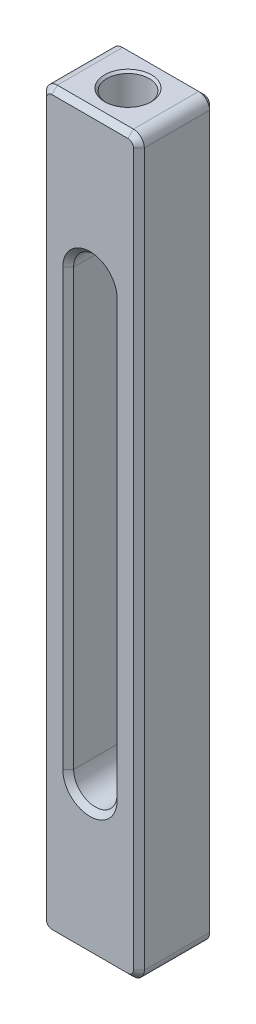
ISO-10303-21;
HEADER;
FILE_DESCRIPTION(('STEP AP214'),'2;1');
FILE_NAME('part.step','',(''),(''),'','','');
FILE_SCHEMA(('AUTOMOTIVE_DESIGN { 1 0 10303 214 1 1 1 1 }'));
ENDSEC;
DATA;
#1=APPLICATION_CONTEXT('core data for automotive mechanical design processes');
#2=APPLICATION_PROTOCOL_DEFINITION('international standard','automotive_design',2000,#1);
#3=PRODUCT_CONTEXT('',#1,'mechanical');
#4=PRODUCT('Part','Part','',(#3));
#5=PRODUCT_RELATED_PRODUCT_CATEGORY('part','',(#4));
#6=PRODUCT_DEFINITION_FORMATION('','',#4);
#7=PRODUCT_DEFINITION_CONTEXT('part definition',#1,'design');
#8=PRODUCT_DEFINITION('design','',#6,#7);
#9=PRODUCT_DEFINITION_SHAPE('','',#8);
#10=(LENGTH_UNIT() NAMED_UNIT(*) SI_UNIT(.MILLI.,.METRE.));
#11=(NAMED_UNIT(*) PLANE_ANGLE_UNIT() SI_UNIT($,.RADIAN.));
#12=(NAMED_UNIT(*) SI_UNIT($,.STERADIAN.) SOLID_ANGLE_UNIT());
#13=UNCERTAINTY_MEASURE_WITH_UNIT(LENGTH_MEASURE(1.E-05),#10,'distance_accuracy_value','');
#14=(GEOMETRIC_REPRESENTATION_CONTEXT(3) GLOBAL_UNCERTAINTY_ASSIGNED_CONTEXT((#13)) GLOBAL_UNIT_ASSIGNED_CONTEXT((#10,
#11,#12)) REPRESENTATION_CONTEXT('',''));
#15=CARTESIAN_POINT('',(0.,0.,0.));
#16=DIRECTION('',(0.,0.,1.));
#17=DIRECTION('',(1.,0.,0.));
#18=AXIS2_PLACEMENT_3D('',#15,#16,#17);
#19=CARTESIAN_POINT('',(4.5,33.75,7.));
#20=DIRECTION('',(0.,0.,-1.));
#21=DIRECTION('',(0.,1.,0.));
#22=AXIS2_PLACEMENT_3D('',#19,#20,#21);
#23=PLANE('',#22);
#24=CARTESIAN_POINT('',(0.,-20.,7.));
#25=DIRECTION('',(0.,0.,-1.));
#26=DIRECTION('',(0.,1.,0.));
#27=AXIS2_PLACEMENT_3D('',#24,#25,#26);
#28=CIRCLE('',#27,2.5);
#29=CARTESIAN_POINT('',(2.5,-20.,7.));
#30=VERTEX_POINT('',#29);
#31=CARTESIAN_POINT('',(-2.5,-20.,7.));
#32=VERTEX_POINT('',#31);
#33=EDGE_CURVE('E33',#30,#32,#28,.T.);
#34=ORIENTED_EDGE('',*,*,#33,.T.);
#35=DIRECTION('',(0.,1.,0.));
#36=VECTOR('',#35,1.);
#37=CARTESIAN_POINT('',(-2.50000000000004,20.,7.));
#38=LINE('',#37,#36);
#39=CARTESIAN_POINT('',(-2.50000000000004,20.,7.));
#40=VERTEX_POINT('',#39);
#41=EDGE_CURVE('E291',#32,#40,#38,.T.);
#42=ORIENTED_EDGE('',*,*,#41,.T.);
#43=CARTESIAN_POINT('',(0.,20.,7.));
#44=DIRECTION('',(0.,0.,-1.));
#45=DIRECTION('',(0.,1.,0.));
#46=AXIS2_PLACEMENT_3D('',#43,#44,#45);
#47=CIRCLE('',#46,2.5);
#48=CARTESIAN_POINT('',(2.5,20.,7.));
#49=VERTEX_POINT('',#48);
#50=EDGE_CURVE('E287',#40,#49,#47,.T.);
#51=ORIENTED_EDGE('',*,*,#50,.T.);
#52=DIRECTION('',(0.,-1.,0.));
#53=VECTOR('',#52,1.);
#54=CARTESIAN_POINT('',(2.5,-20.,7.));
#55=LINE('',#54,#53);
#56=EDGE_CURVE('E38',#49,#30,#55,.T.);
#57=ORIENTED_EDGE('',*,*,#56,.T.);
#58=EDGE_LOOP('',(#34,#42,#51,#57));
#59=FACE_BOUND('',#58,.T.);
#60=DIRECTION('',(1.,0.,0.));
#61=VECTOR('',#60,1.);
#62=CARTESIAN_POINT('',(4.5,-33.25,7.));
#63=LINE('',#62,#61);
#64=CARTESIAN_POINT('',(-3.5,-33.25,7.));
#65=VERTEX_POINT('',#64);
#66=CARTESIAN_POINT('',(3.5,-33.25,7.));
#67=VERTEX_POINT('',#66);
#68=EDGE_CURVE('E282',#65,#67,#63,.T.);
#69=ORIENTED_EDGE('',*,*,#68,.T.);
#70=CARTESIAN_POINT('',(3.5,-32.75,7.));
#71=DIRECTION('',(0.,0.,-1.));
#72=DIRECTION('',(0.,1.,0.));
#73=AXIS2_PLACEMENT_3D('',#70,#71,#72);
#74=CIRCLE('',#73,0.499999999999993);
#75=CARTESIAN_POINT('',(4.,-32.75,7.));
#76=VERTEX_POINT('',#75);
#77=EDGE_CURVE('E284',#67,#76,#74,.F.);
#78=ORIENTED_EDGE('',*,*,#77,.T.);
#79=DIRECTION('',(0.,1.,0.));
#80=VECTOR('',#79,1.);
#81=CARTESIAN_POINT('',(4.,32.75,7.));
#82=LINE('',#81,#80);
#83=CARTESIAN_POINT('',(4.,32.75,7.));
#84=VERTEX_POINT('',#83);
#85=EDGE_CURVE('E270',#76,#84,#82,.T.);
#86=ORIENTED_EDGE('',*,*,#85,.T.);
#87=CARTESIAN_POINT('',(3.5,32.75,7.));
#88=DIRECTION('',(0.,0.,-1.));
#89=DIRECTION('',(0.,1.,0.));
#90=AXIS2_PLACEMENT_3D('',#87,#88,#89);
#91=CIRCLE('',#90,0.499999999999994);
#92=CARTESIAN_POINT('',(3.5,33.25,7.));
#93=VERTEX_POINT('',#92);
#94=EDGE_CURVE('E272',#84,#93,#91,.F.);
#95=ORIENTED_EDGE('',*,*,#94,.T.);
#96=DIRECTION('',(-1.,0.,0.));
#97=VECTOR('',#96,1.);
#98=CARTESIAN_POINT('',(4.5,33.25,7.));
#99=LINE('',#98,#97);
#100=CARTESIAN_POINT('',(-3.5,33.25,7.));
#101=VERTEX_POINT('',#100);
#102=EDGE_CURVE('E274',#93,#101,#99,.T.);
#103=ORIENTED_EDGE('',*,*,#102,.T.);
#104=CARTESIAN_POINT('',(-3.5,32.75,7.));
#105=DIRECTION('',(0.,0.,-1.));
#106=DIRECTION('',(0.,1.,0.));
#107=AXIS2_PLACEMENT_3D('',#104,#105,#106);
#108=CIRCLE('',#107,0.499999999999993);
#109=CARTESIAN_POINT('',(-4.,32.75,7.));
#110=VERTEX_POINT('',#109);
#111=EDGE_CURVE('E276',#101,#110,#108,.F.);
#112=ORIENTED_EDGE('',*,*,#111,.T.);
#113=DIRECTION('',(0.,-1.,0.));
#114=VECTOR('',#113,1.);
#115=CARTESIAN_POINT('',(-4.,33.75,7.));
#116=LINE('',#115,#114);
#117=CARTESIAN_POINT('',(-4.,-32.75,7.));
#118=VERTEX_POINT('',#117);
#119=EDGE_CURVE('E278',#110,#118,#116,.T.);
#120=ORIENTED_EDGE('',*,*,#119,.T.);
#121=CARTESIAN_POINT('',(-3.5,-32.75,7.));
#122=DIRECTION('',(0.,0.,-1.));
#123=DIRECTION('',(0.,1.,0.));
#124=AXIS2_PLACEMENT_3D('',#121,#122,#123);
#125=CIRCLE('',#124,0.499999999999994);
#126=EDGE_CURVE('E280',#118,#65,#125,.F.);
#127=ORIENTED_EDGE('',*,*,#126,.T.);
#128=EDGE_LOOP('',(#69,#78,#86,#95,#103,#112,#120,#127));
#129=FACE_BOUND('',#128,.T.);
#130=ADVANCED_FACE('F17',(#59,#129),#23,.F.);
#131=CARTESIAN_POINT('',(4.5,33.75,0.));
#132=DIRECTION('',(0.,0.,1.));
#133=DIRECTION('',(0.,-1.,0.));
#134=AXIS2_PLACEMENT_3D('',#131,#132,#133);
#135=PLANE('',#134);
#136=CARTESIAN_POINT('',(0.,-20.,0.));
#137=DIRECTION('',(0.,0.,1.));
#138=DIRECTION('',(0.,-1.,0.));
#139=AXIS2_PLACEMENT_3D('',#136,#137,#138);
#140=CIRCLE('',#139,2.49999999999997);
#141=CARTESIAN_POINT('',(-2.49999999999997,-20.,0.));
#142=VERTEX_POINT('',#141);
#143=CARTESIAN_POINT('',(2.49999999999997,-20.,0.));
#144=VERTEX_POINT('',#143);
#145=EDGE_CURVE('E215',#142,#144,#140,.T.);
#146=ORIENTED_EDGE('',*,*,#145,.T.);
#147=DIRECTION('',(0.,1.,0.));
#148=VECTOR('',#147,1.);
#149=CARTESIAN_POINT('',(2.49999999999996,20.,0.));
#150=LINE('',#149,#148);
#151=CARTESIAN_POINT('',(2.49999999999996,20.,0.));
#152=VERTEX_POINT('',#151);
#153=EDGE_CURVE('E217',#144,#152,#150,.T.);
#154=ORIENTED_EDGE('',*,*,#153,.T.);
#155=CARTESIAN_POINT('',(0.,20.,0.));
#156=DIRECTION('',(0.,0.,1.));
#157=DIRECTION('',(0.,-1.,0.));
#158=AXIS2_PLACEMENT_3D('',#155,#156,#157);
#159=CIRCLE('',#158,2.49999999999997);
#160=CARTESIAN_POINT('',(-2.5,20.,0.));
#161=VERTEX_POINT('',#160);
#162=EDGE_CURVE('E206',#152,#161,#159,.T.);
#163=ORIENTED_EDGE('',*,*,#162,.T.);
#164=DIRECTION('',(0.,-1.,0.));
#165=VECTOR('',#164,1.);
#166=CARTESIAN_POINT('',(-2.49999999999997,-20.,0.));
#167=LINE('',#166,#165);
#168=EDGE_CURVE('E208',#161,#142,#167,.T.);
#169=ORIENTED_EDGE('',*,*,#168,.T.);
#170=EDGE_LOOP('',(#146,#154,#163,#169));
#171=FACE_BOUND('',#170,.T.);
#172=DIRECTION('',(0.,1.,0.));
#173=VECTOR('',#172,1.);
#174=CARTESIAN_POINT('',(-4.,33.75,0.));
#175=LINE('',#174,#173);
#176=CARTESIAN_POINT('',(-4.,-32.75,0.));
#177=VERTEX_POINT('',#176);
#178=CARTESIAN_POINT('',(-4.,32.75,0.));
#179=VERTEX_POINT('',#178);
#180=EDGE_CURVE('E204',#177,#179,#175,.T.);
#181=ORIENTED_EDGE('',*,*,#180,.T.);
#182=CARTESIAN_POINT('',(-3.5,32.75,0.));
#183=DIRECTION('',(0.,0.,1.));
#184=DIRECTION('',(0.,-1.,0.));
#185=AXIS2_PLACEMENT_3D('',#182,#183,#184);
#186=CIRCLE('',#185,0.5);
#187=CARTESIAN_POINT('',(-3.5,33.25,0.));
#188=VERTEX_POINT('',#187);
#189=EDGE_CURVE('E184',#179,#188,#186,.F.);
#190=ORIENTED_EDGE('',*,*,#189,.T.);
#191=DIRECTION('',(1.,0.,0.));
#192=VECTOR('',#191,1.);
#193=CARTESIAN_POINT('',(4.5,33.25,0.));
#194=LINE('',#193,#192);
#195=CARTESIAN_POINT('',(3.5,33.25,0.));
#196=VERTEX_POINT('',#195);
#197=EDGE_CURVE('E193',#188,#196,#194,.T.);
#198=ORIENTED_EDGE('',*,*,#197,.T.);
#199=CARTESIAN_POINT('',(3.5,32.75,0.));
#200=DIRECTION('',(0.,0.,1.));
#201=DIRECTION('',(0.,-1.,0.));
#202=AXIS2_PLACEMENT_3D('',#199,#200,#201);
#203=CIRCLE('',#202,0.5);
#204=CARTESIAN_POINT('',(4.,32.75,0.));
#205=VERTEX_POINT('',#204);
#206=EDGE_CURVE('E199',#196,#205,#203,.F.);
#207=ORIENTED_EDGE('',*,*,#206,.T.);
#208=DIRECTION('',(0.,-1.,0.));
#209=VECTOR('',#208,1.);
#210=CARTESIAN_POINT('',(4.,-32.75,0.));
#211=LINE('',#210,#209);
#212=CARTESIAN_POINT('',(4.,-32.75,0.));
#213=VERTEX_POINT('',#212);
#214=EDGE_CURVE('E610',#205,#213,#211,.T.);
#215=ORIENTED_EDGE('',*,*,#214,.T.);
#216=CARTESIAN_POINT('',(3.5,-32.75,0.));
#217=DIRECTION('',(0.,0.,1.));
#218=DIRECTION('',(0.,-1.,0.));
#219=AXIS2_PLACEMENT_3D('',#216,#217,#218);
#220=CIRCLE('',#219,0.5);
#221=CARTESIAN_POINT('',(3.5,-33.25,0.));
#222=VERTEX_POINT('',#221);
#223=EDGE_CURVE('E612',#213,#222,#220,.F.);
#224=ORIENTED_EDGE('',*,*,#223,.T.);
#225=DIRECTION('',(-1.,0.,0.));
#226=VECTOR('',#225,1.);
#227=CARTESIAN_POINT('',(4.5,-33.25,0.));
#228=LINE('',#227,#226);
#229=CARTESIAN_POINT('',(-3.5,-33.25,0.));
#230=VERTEX_POINT('',#229);
#231=EDGE_CURVE('E614',#222,#230,#228,.T.);
#232=ORIENTED_EDGE('',*,*,#231,.T.);
#233=CARTESIAN_POINT('',(-3.5,-32.75,0.));
#234=DIRECTION('',(0.,0.,1.));
#235=DIRECTION('',(0.,-1.,0.));
#236=AXIS2_PLACEMENT_3D('',#233,#234,#235);
#237=CIRCLE('',#236,0.5);
#238=EDGE_CURVE('E210',#230,#177,#237,.F.);
#239=ORIENTED_EDGE('',*,*,#238,.T.);
#240=EDGE_LOOP('',(#181,#190,#198,#207,#215,#224,#232,#239));
#241=FACE_BOUND('',#240,.T.);
#242=ADVANCED_FACE('F202',(#171,#241),#135,.F.);
#243=CARTESIAN_POINT('',(4.5,-33.75,7.));
#244=DIRECTION('',(0.,1.,0.));
#245=DIRECTION('',(0.,0.,1.));
#246=AXIS2_PLACEMENT_3D('',#243,#244,#245);
#247=PLANE('',#246);
#248=CARTESIAN_POINT('',(0.,-33.75,3.5));
#249=DIRECTION('',(0.,1.,0.));
#250=DIRECTION('',(0.,0.,1.));
#251=AXIS2_PLACEMENT_3D('',#248,#249,#250);
#252=CIRCLE('',#251,2.15);
#253=CARTESIAN_POINT('',(0.,-33.75,5.65));
#254=VERTEX_POINT('',#253);
#255=EDGE_CURVE('E355',#254,#254,#252,.T.);
#256=ORIENTED_EDGE('',*,*,#255,.T.);
#257=EDGE_LOOP('',(#256));
#258=FACE_BOUND('',#257,.T.);
#259=DIRECTION('',(0.,0.,-1.));
#260=VECTOR('',#259,1.);
#261=CARTESIAN_POINT('',(-3.5,-33.75,7.));
#262=LINE('',#261,#260);
#263=CARTESIAN_POINT('',(-3.5,-33.75,6.5));
#264=VERTEX_POINT('',#263);
#265=CARTESIAN_POINT('',(-3.5,-33.75,0.499999999999994));
#266=VERTEX_POINT('',#265);
#267=EDGE_CURVE('E200',#264,#266,#262,.T.);
#268=ORIENTED_EDGE('',*,*,#267,.T.);
#269=DIRECTION('',(1.,0.,0.));
#270=VECTOR('',#269,1.);
#271=CARTESIAN_POINT('',(4.5,-33.75,0.499999999999994));
#272=LINE('',#271,#270);
#273=CARTESIAN_POINT('',(3.5,-33.75,0.499999999999994));
#274=VERTEX_POINT('',#273);
#275=EDGE_CURVE('E251',#266,#274,#272,.T.);
#276=ORIENTED_EDGE('',*,*,#275,.T.);
#277=DIRECTION('',(0.,0.,-1.));
#278=VECTOR('',#277,1.);
#279=CARTESIAN_POINT('',(3.5,-33.75,7.));
#280=LINE('',#279,#278);
#281=CARTESIAN_POINT('',(3.5,-33.75,6.5));
#282=VERTEX_POINT('',#281);
#283=EDGE_CURVE('E604',#274,#282,#280,.F.);
#284=ORIENTED_EDGE('',*,*,#283,.T.);
#285=DIRECTION('',(-1.,0.,0.));
#286=VECTOR('',#285,1.);
#287=CARTESIAN_POINT('',(4.5,-33.75,6.5));
#288=LINE('',#287,#286);
#289=EDGE_CURVE('E249',#282,#264,#288,.T.);
#290=ORIENTED_EDGE('',*,*,#289,.T.);
#291=EDGE_LOOP('',(#268,#276,#284,#290));
#292=FACE_BOUND('',#291,.T.);
#293=ADVANCED_FACE('F380',(#258,#292),#247,.F.);
#294=CARTESIAN_POINT('',(4.5,33.75,7.));
#295=DIRECTION('',(0.,-1.,0.));
#296=DIRECTION('',(0.,0.,-1.));
#297=AXIS2_PLACEMENT_3D('',#294,#295,#296);
#298=PLANE('',#297);
#299=CARTESIAN_POINT('',(0.,33.75,3.5));
#300=DIRECTION('',(0.,-1.,0.));
#301=DIRECTION('',(0.,0.,-1.));
#302=AXIS2_PLACEMENT_3D('',#299,#300,#301);
#303=CIRCLE('',#302,2.15);
#304=CARTESIAN_POINT('',(0.,33.75,1.35));
#305=VERTEX_POINT('',#304);
#306=EDGE_CURVE('E26',#305,#305,#303,.T.);
#307=ORIENTED_EDGE('',*,*,#306,.T.);
#308=EDGE_LOOP('',(#307));
#309=FACE_BOUND('',#308,.T.);
#310=DIRECTION('',(0.,0.,1.));
#311=VECTOR('',#310,1.);
#312=CARTESIAN_POINT('',(3.5,33.75,0.));
#313=LINE('',#312,#311);
#314=CARTESIAN_POINT('',(3.5,33.75,6.5));
#315=VERTEX_POINT('',#314);
#316=CARTESIAN_POINT('',(3.5,33.75,0.500000000000007));
#317=VERTEX_POINT('',#316);
#318=EDGE_CURVE('E587',#315,#317,#313,.F.);
#319=ORIENTED_EDGE('',*,*,#318,.T.);
#320=DIRECTION('',(-1.,0.,0.));
#321=VECTOR('',#320,1.);
#322=CARTESIAN_POINT('',(4.5,33.75,0.500000000000007));
#323=LINE('',#322,#321);
#324=CARTESIAN_POINT('',(-3.5,33.75,0.500000000000007));
#325=VERTEX_POINT('',#324);
#326=EDGE_CURVE('E268',#317,#325,#323,.T.);
#327=ORIENTED_EDGE('',*,*,#326,.T.);
#328=DIRECTION('',(0.,0.,1.));
#329=VECTOR('',#328,1.);
#330=CARTESIAN_POINT('',(-3.5,33.75,7.));
#331=LINE('',#330,#329);
#332=CARTESIAN_POINT('',(-3.5,33.75,6.5));
#333=VERTEX_POINT('',#332);
#334=EDGE_CURVE('E589',#325,#333,#331,.T.);
#335=ORIENTED_EDGE('',*,*,#334,.T.);
#336=DIRECTION('',(1.,0.,0.));
#337=VECTOR('',#336,1.);
#338=CARTESIAN_POINT('',(4.5,33.75,6.5));
#339=LINE('',#338,#337);
#340=EDGE_CURVE('E266',#333,#315,#339,.T.);
#341=ORIENTED_EDGE('',*,*,#340,.T.);
#342=EDGE_LOOP('',(#319,#327,#335,#341));
#343=FACE_BOUND('',#342,.T.);
#344=ADVANCED_FACE('F360',(#309,#343),#298,.F.);
#345=CARTESIAN_POINT('',(4.5,0.,0.));
#346=DIRECTION('',(1.,0.,0.));
#347=DIRECTION('',(0.,0.,-1.));
#348=AXIS2_PLACEMENT_3D('',#345,#346,#347);
#349=PLANE('',#348);
#350=DIRECTION('',(0.,0.,-1.));
#351=VECTOR('',#350,1.);
#352=CARTESIAN_POINT('',(4.5,-32.75,0.));
#353=LINE('',#352,#351);
#354=CARTESIAN_POINT('',(4.5,-32.75,6.5));
#355=VERTEX_POINT('',#354);
#356=CARTESIAN_POINT('',(4.5,-32.75,0.499999999999994));
#357=VERTEX_POINT('',#356);
#358=EDGE_CURVE('E642',#355,#357,#353,.T.);
#359=ORIENTED_EDGE('',*,*,#358,.T.);
#360=DIRECTION('',(0.,1.,0.));
#361=VECTOR('',#360,1.);
#362=CARTESIAN_POINT('',(4.5,32.75,0.500000000000007));
#363=LINE('',#362,#361);
#364=CARTESIAN_POINT('',(4.5,32.75,0.500000000000007));
#365=VERTEX_POINT('',#364);
#366=EDGE_CURVE('E260',#357,#365,#363,.T.);
#367=ORIENTED_EDGE('',*,*,#366,.T.);
#368=DIRECTION('',(0.,0.,1.));
#369=VECTOR('',#368,1.);
#370=CARTESIAN_POINT('',(4.5,32.75,7.));
#371=LINE('',#370,#369);
#372=CARTESIAN_POINT('',(4.5,32.75,6.5));
#373=VERTEX_POINT('',#372);
#374=EDGE_CURVE('E598',#365,#373,#371,.T.);
#375=ORIENTED_EDGE('',*,*,#374,.T.);
#376=DIRECTION('',(0.,-1.,0.));
#377=VECTOR('',#376,1.);
#378=CARTESIAN_POINT('',(4.5,-32.75,6.5));
#379=LINE('',#378,#377);
#380=EDGE_CURVE('E258',#373,#355,#379,.T.);
#381=ORIENTED_EDGE('',*,*,#380,.T.);
#382=EDGE_LOOP('',(#359,#367,#375,#381));
#383=FACE_BOUND('',#382,.T.);
#384=ADVANCED_FACE('F641',(#383),#349,.T.);
#385=CARTESIAN_POINT('',(-4.5,0.,0.));
#386=DIRECTION('',(1.,0.,0.));
#387=DIRECTION('',(0.,0.,-1.));
#388=AXIS2_PLACEMENT_3D('',#385,#386,#387);
#389=PLANE('',#388);
#390=DIRECTION('',(0.,0.,1.));
#391=VECTOR('',#390,1.);
#392=CARTESIAN_POINT('',(-4.5,32.75,0.));
#393=LINE('',#392,#391);
#394=CARTESIAN_POINT('',(-4.5,32.75,6.5));
#395=VERTEX_POINT('',#394);
#396=CARTESIAN_POINT('',(-4.5,32.75,0.500000000000007));
#397=VERTEX_POINT('',#396);
#398=EDGE_CURVE('E596',#395,#397,#393,.F.);
#399=ORIENTED_EDGE('',*,*,#398,.T.);
#400=DIRECTION('',(0.,-1.,0.));
#401=VECTOR('',#400,1.);
#402=CARTESIAN_POINT('',(-4.5,0.,0.5));
#403=LINE('',#402,#401);
#404=CARTESIAN_POINT('',(-4.5,-32.75,0.499999999999994));
#405=VERTEX_POINT('',#404);
#406=EDGE_CURVE('E243',#397,#405,#403,.T.);
#407=ORIENTED_EDGE('',*,*,#406,.T.);
#408=DIRECTION('',(0.,0.,-1.));
#409=VECTOR('',#408,1.);
#410=CARTESIAN_POINT('',(-4.5,-32.75,0.));
#411=LINE('',#410,#409);
#412=CARTESIAN_POINT('',(-4.5,-32.75,6.5));
#413=VERTEX_POINT('',#412);
#414=EDGE_CURVE('E593',#405,#413,#411,.F.);
#415=ORIENTED_EDGE('',*,*,#414,.T.);
#416=DIRECTION('',(0.,1.,0.));
#417=VECTOR('',#416,1.);
#418=CARTESIAN_POINT('',(-4.5,0.,6.5));
#419=LINE('',#418,#417);
#420=EDGE_CURVE('E241',#413,#395,#419,.T.);
#421=ORIENTED_EDGE('',*,*,#420,.T.);
#422=EDGE_LOOP('',(#399,#407,#415,#421));
#423=FACE_BOUND('',#422,.T.);
#424=ADVANCED_FACE('F624',(#423),#389,.F.);
#425=CARTESIAN_POINT('',(0.,-23.75,3.5));
#426=DIRECTION('',(0.,-1.,0.));
#427=DIRECTION('',(0.,0.,-1.));
#428=AXIS2_PLACEMENT_3D('',#425,#426,#427);
#429=CYLINDRICAL_SURFACE('',#428,1.95);
#430=CARTESIAN_POINT('',(0.,-33.55,3.5));
#431=DIRECTION('',(0.,1.,0.));
#432=DIRECTION('',(0.,0.,1.));
#433=AXIS2_PLACEMENT_3D('',#430,#431,#432);
#434=CIRCLE('',#433,1.95);
#435=CARTESIAN_POINT('',(0.,-33.55,5.45));
#436=VERTEX_POINT('',#435);
#437=EDGE_CURVE('E293',#436,#436,#434,.F.);
#438=ORIENTED_EDGE('',*,*,#437,.T.);
#439=EDGE_LOOP('',(#438));
#440=FACE_BOUND('',#439,.T.);
#441=CARTESIAN_POINT('',(0.,-23.75,3.5));
#442=DIRECTION('',(0.,-1.,0.));
#443=DIRECTION('',(0.,0.,-1.));
#444=AXIS2_PLACEMENT_3D('',#441,#442,#443);
#445=CIRCLE('',#444,1.95);
#446=CARTESIAN_POINT('',(0.,-23.75,1.55));
#447=VERTEX_POINT('',#446);
#448=EDGE_CURVE('E647',#447,#447,#445,.T.);
#449=ORIENTED_EDGE('',*,*,#448,.F.);
#450=EDGE_LOOP('',(#449));
#451=FACE_BOUND('',#450,.T.);
#452=ADVANCED_FACE('F726',(#440,#451),#429,.F.);
#453=CARTESIAN_POINT('',(0.,-23.75,3.5));
#454=DIRECTION('',(0.,-1.,0.));
#455=DIRECTION('',(0.,0.,-1.));
#456=AXIS2_PLACEMENT_3D('',#453,#454,#455);
#457=PLANE('',#456);
#458=ORIENTED_EDGE('',*,*,#448,.T.);
#459=EDGE_LOOP('',(#458));
#460=FACE_BOUND('',#459,.T.);
#461=ADVANCED_FACE('F722',(#460),#457,.T.);
#462=CARTESIAN_POINT('',(0.,23.75,3.5));
#463=DIRECTION('',(0.,1.,0.));
#464=DIRECTION('',(0.,0.,1.));
#465=AXIS2_PLACEMENT_3D('',#462,#463,#464);
#466=CYLINDRICAL_SURFACE('',#465,1.95);
#467=CARTESIAN_POINT('',(0.,33.55,3.5));
#468=DIRECTION('',(0.,-1.,0.));
#469=DIRECTION('',(0.,0.,-1.));
#470=AXIS2_PLACEMENT_3D('',#467,#468,#469);
#471=CIRCLE('',#470,1.95);
#472=CARTESIAN_POINT('',(0.,33.55,1.55));
#473=VERTEX_POINT('',#472);
#474=EDGE_CURVE('E11',#473,#473,#471,.F.);
#475=ORIENTED_EDGE('',*,*,#474,.T.);
#476=EDGE_LOOP('',(#475));
#477=FACE_BOUND('',#476,.T.);
#478=CARTESIAN_POINT('',(0.,23.75,3.5));
#479=DIRECTION('',(0.,-1.,0.));
#480=DIRECTION('',(0.,0.,-1.));
#481=AXIS2_PLACEMENT_3D('',#478,#479,#480);
#482=CIRCLE('',#481,1.95);
#483=CARTESIAN_POINT('',(0.,23.75,1.55));
#484=VERTEX_POINT('',#483);
#485=EDGE_CURVE('E662',#484,#484,#482,.T.);
#486=ORIENTED_EDGE('',*,*,#485,.T.);
#487=EDGE_LOOP('',(#486));
#488=FACE_BOUND('',#487,.T.);
#489=ADVANCED_FACE('F715',(#477,#488),#466,.F.);
#490=CARTESIAN_POINT('',(0.,23.75,3.5));
#491=DIRECTION('',(0.,1.,0.));
#492=DIRECTION('',(0.,0.,-1.));
#493=AXIS2_PLACEMENT_3D('',#490,#491,#492);
#494=PLANE('',#493);
#495=ORIENTED_EDGE('',*,*,#485,.F.);
#496=EDGE_LOOP('',(#495));
#497=FACE_BOUND('',#496,.T.);
#498=ADVANCED_FACE('F707',(#497),#494,.T.);
#499=CARTESIAN_POINT('',(0.,20.,7.));
#500=DIRECTION('',(0.,0.,-1.));
#501=DIRECTION('',(-1.,0.,0.));
#502=AXIS2_PLACEMENT_3D('',#499,#500,#501);
#503=CYLINDRICAL_SURFACE('',#502,2.);
#504=DIRECTION('',(0.,0.,-1.));
#505=VECTOR('',#504,1.);
#506=CARTESIAN_POINT('',(-2.,20.,7.));
#507=LINE('',#506,#505);
#508=CARTESIAN_POINT('',(-2.,20.,6.5));
#509=VERTEX_POINT('',#508);
#510=CARTESIAN_POINT('',(-2.,20.,0.49999999999998));
#511=VERTEX_POINT('',#510);
#512=EDGE_CURVE('E665',#509,#511,#507,.T.);
#513=ORIENTED_EDGE('',*,*,#512,.T.);
#514=CARTESIAN_POINT('',(0.,20.,0.499999999999978));
#515=DIRECTION('',(0.,0.,1.));
#516=DIRECTION('',(1.,0.,0.));
#517=AXIS2_PLACEMENT_3D('',#514,#515,#516);
#518=CIRCLE('',#517,2.);
#519=CARTESIAN_POINT('',(2.,20.,0.49999999999998));
#520=VERTEX_POINT('',#519);
#521=EDGE_CURVE('E236',#511,#520,#518,.F.);
#522=ORIENTED_EDGE('',*,*,#521,.T.);
#523=DIRECTION('',(0.,0.,-1.));
#524=VECTOR('',#523,1.);
#525=CARTESIAN_POINT('',(2.,20.,7.));
#526=LINE('',#525,#524);
#527=CARTESIAN_POINT('',(2.,20.,6.5));
#528=VERTEX_POINT('',#527);
#529=EDGE_CURVE('E304',#528,#520,#526,.T.);
#530=ORIENTED_EDGE('',*,*,#529,.F.);
#531=CARTESIAN_POINT('',(0.,20.,6.5));
#532=DIRECTION('',(0.,0.,-1.));
#533=DIRECTION('',(-1.,0.,0.));
#534=AXIS2_PLACEMENT_3D('',#531,#532,#533);
#535=CIRCLE('',#534,2.);
#536=EDGE_CURVE('E234',#528,#509,#535,.F.);
#537=ORIENTED_EDGE('',*,*,#536,.T.);
#538=EDGE_LOOP('',(#513,#522,#530,#537));
#539=FACE_BOUND('',#538,.T.);
#540=ADVANCED_FACE('F705',(#539),#503,.F.);
#541=CARTESIAN_POINT('',(-2.,20.,7.));
#542=DIRECTION('',(1.,0.,0.));
#543=DIRECTION('',(0.,1.,0.));
#544=AXIS2_PLACEMENT_3D('',#541,#542,#543);
#545=PLANE('',#544);
#546=DIRECTION('',(0.,0.,-1.));
#547=VECTOR('',#546,1.);
#548=CARTESIAN_POINT('',(-2.,-20.,7.));
#549=LINE('',#548,#547);
#550=CARTESIAN_POINT('',(-2.,-20.,6.5));
#551=VERTEX_POINT('',#550);
#552=CARTESIAN_POINT('',(-2.,-20.,0.499999999999971));
#553=VERTEX_POINT('',#552);
#554=EDGE_CURVE('E668',#551,#553,#549,.T.);
#555=ORIENTED_EDGE('',*,*,#554,.T.);
#556=DIRECTION('',(0.,1.,0.));
#557=VECTOR('',#556,1.);
#558=CARTESIAN_POINT('',(-2.,20.,0.499999999999978));
#559=LINE('',#558,#557);
#560=EDGE_CURVE('E232',#553,#511,#559,.T.);
#561=ORIENTED_EDGE('',*,*,#560,.T.);
#562=ORIENTED_EDGE('',*,*,#512,.F.);
#563=DIRECTION('',(0.,-1.,0.));
#564=VECTOR('',#563,1.);
#565=CARTESIAN_POINT('',(-2.,-20.,6.5));
#566=LINE('',#565,#564);
#567=EDGE_CURVE('E229',#509,#551,#566,.T.);
#568=ORIENTED_EDGE('',*,*,#567,.T.);
#569=EDGE_LOOP('',(#555,#561,#562,#568));
#570=FACE_BOUND('',#569,.T.);
#571=ADVANCED_FACE('F697',(#570),#545,.T.);
#572=CARTESIAN_POINT('',(0.,-20.,7.));
#573=DIRECTION('',(0.,0.,-1.));
#574=DIRECTION('',(-1.,0.,0.));
#575=AXIS2_PLACEMENT_3D('',#572,#573,#574);
#576=CYLINDRICAL_SURFACE('',#575,2.);
#577=DIRECTION('',(0.,0.,-1.));
#578=VECTOR('',#577,1.);
#579=CARTESIAN_POINT('',(2.,-20.,7.));
#580=LINE('',#579,#578);
#581=CARTESIAN_POINT('',(2.,-20.,6.5));
#582=VERTEX_POINT('',#581);
#583=CARTESIAN_POINT('',(2.,-20.,0.499999999999971));
#584=VERTEX_POINT('',#583);
#585=EDGE_CURVE('E671',#582,#584,#580,.T.);
#586=ORIENTED_EDGE('',*,*,#585,.T.);
#587=CARTESIAN_POINT('',(0.,-20.,0.499999999999969));
#588=DIRECTION('',(0.,0.,1.));
#589=DIRECTION('',(1.,0.,0.));
#590=AXIS2_PLACEMENT_3D('',#587,#588,#589);
#591=CIRCLE('',#590,2.);
#592=EDGE_CURVE('E227',#584,#553,#591,.F.);
#593=ORIENTED_EDGE('',*,*,#592,.T.);
#594=ORIENTED_EDGE('',*,*,#554,.F.);
#595=CARTESIAN_POINT('',(0.,-20.,6.5));
#596=DIRECTION('',(0.,0.,-1.));
#597=DIRECTION('',(-1.,0.,0.));
#598=AXIS2_PLACEMENT_3D('',#595,#596,#597);
#599=CIRCLE('',#598,2.);
#600=EDGE_CURVE('E225',#551,#582,#599,.F.);
#601=ORIENTED_EDGE('',*,*,#600,.T.);
#602=EDGE_LOOP('',(#586,#593,#594,#601));
#603=FACE_BOUND('',#602,.T.);
#604=ADVANCED_FACE('F694',(#603),#576,.F.);
#605=CARTESIAN_POINT('',(2.,20.,7.));
#606=DIRECTION('',(-1.,0.,0.));
#607=DIRECTION('',(0.,-1.,0.));
#608=AXIS2_PLACEMENT_3D('',#605,#606,#607);
#609=PLANE('',#608);
#610=ORIENTED_EDGE('',*,*,#529,.T.);
#611=DIRECTION('',(0.,-1.,0.));
#612=VECTOR('',#611,1.);
#613=CARTESIAN_POINT('',(2.,-20.,0.49999999999997));
#614=LINE('',#613,#612);
#615=EDGE_CURVE('E222',#520,#584,#614,.T.);
#616=ORIENTED_EDGE('',*,*,#615,.T.);
#617=ORIENTED_EDGE('',*,*,#585,.F.);
#618=DIRECTION('',(0.,1.,0.));
#619=VECTOR('',#618,1.);
#620=CARTESIAN_POINT('',(2.,20.,6.5));
#621=LINE('',#620,#619);
#622=EDGE_CURVE('E220',#582,#528,#621,.T.);
#623=ORIENTED_EDGE('',*,*,#622,.T.);
#624=EDGE_LOOP('',(#610,#616,#617,#623));
#625=FACE_BOUND('',#624,.T.);
#626=ADVANCED_FACE('F390',(#625),#609,.T.);
#627=CARTESIAN_POINT('',(3.5,32.75,0.));
#628=DIRECTION('',(0.,0.,-1.));
#629=DIRECTION('',(-1.,0.,0.));
#630=AXIS2_PLACEMENT_3D('',#627,#628,#629);
#631=CYLINDRICAL_SURFACE('',#630,1.);
#632=ORIENTED_EDGE('',*,*,#374,.F.);
#633=CARTESIAN_POINT('',(3.5,32.75,0.500000000000007));
#634=DIRECTION('',(0.,0.,1.));
#635=DIRECTION('',(1.,0.,0.));
#636=AXIS2_PLACEMENT_3D('',#633,#634,#635);
#637=CIRCLE('',#636,1.);
#638=EDGE_CURVE('E264',#365,#317,#637,.T.);
#639=ORIENTED_EDGE('',*,*,#638,.T.);
#640=ORIENTED_EDGE('',*,*,#318,.F.);
#641=CARTESIAN_POINT('',(3.5,32.75,6.5));
#642=DIRECTION('',(0.,0.,-1.));
#643=DIRECTION('',(-1.,0.,0.));
#644=AXIS2_PLACEMENT_3D('',#641,#642,#643);
#645=CIRCLE('',#644,1.);
#646=EDGE_CURVE('E262',#315,#373,#645,.T.);
#647=ORIENTED_EDGE('',*,*,#646,.T.);
#648=EDGE_LOOP('',(#632,#639,#640,#647));
#649=FACE_BOUND('',#648,.T.);
#650=ADVANCED_FACE('F386',(#649),#631,.T.);
#651=CARTESIAN_POINT('',(-3.5,32.75,7.));
#652=DIRECTION('',(0.,0.,1.));
#653=DIRECTION('',(1.,0.,0.));
#654=AXIS2_PLACEMENT_3D('',#651,#652,#653);
#655=CYLINDRICAL_SURFACE('',#654,1.);
#656=ORIENTED_EDGE('',*,*,#334,.F.);
#657=CARTESIAN_POINT('',(-3.5,32.75,0.500000000000007));
#658=DIRECTION('',(0.,0.,1.));
#659=DIRECTION('',(1.,0.,0.));
#660=AXIS2_PLACEMENT_3D('',#657,#658,#659);
#661=CIRCLE('',#660,1.);
#662=EDGE_CURVE('E186',#325,#397,#661,.T.);
#663=ORIENTED_EDGE('',*,*,#662,.T.);
#664=ORIENTED_EDGE('',*,*,#398,.F.);
#665=CARTESIAN_POINT('',(-3.5,32.75,6.5));
#666=DIRECTION('',(0.,0.,-1.));
#667=DIRECTION('',(-1.,0.,0.));
#668=AXIS2_PLACEMENT_3D('',#665,#666,#667);
#669=CIRCLE('',#668,1.);
#670=EDGE_CURVE('E238',#395,#333,#669,.T.);
#671=ORIENTED_EDGE('',*,*,#670,.T.);
#672=EDGE_LOOP('',(#656,#663,#664,#671));
#673=FACE_BOUND('',#672,.T.);
#674=ADVANCED_FACE('F389',(#673),#655,.T.);
#675=CARTESIAN_POINT('',(-3.5,-32.75,7.));
#676=DIRECTION('',(0.,0.,-1.));
#677=DIRECTION('',(-1.,0.,0.));
#678=AXIS2_PLACEMENT_3D('',#675,#676,#677);
#679=CYLINDRICAL_SURFACE('',#678,1.);
#680=ORIENTED_EDGE('',*,*,#414,.F.);
#681=CARTESIAN_POINT('',(-3.5,-32.75,0.499999999999994));
#682=DIRECTION('',(0.,0.,1.));
#683=DIRECTION('',(1.,0.,0.));
#684=AXIS2_PLACEMENT_3D('',#681,#682,#683);
#685=CIRCLE('',#684,1.);
#686=EDGE_CURVE('E247',#405,#266,#685,.T.);
#687=ORIENTED_EDGE('',*,*,#686,.T.);
#688=ORIENTED_EDGE('',*,*,#267,.F.);
#689=CARTESIAN_POINT('',(-3.5,-32.75,6.5));
#690=DIRECTION('',(0.,0.,-1.));
#691=DIRECTION('',(-1.,0.,0.));
#692=AXIS2_PLACEMENT_3D('',#689,#690,#691);
#693=CIRCLE('',#692,1.);
#694=EDGE_CURVE('E245',#264,#413,#693,.T.);
#695=ORIENTED_EDGE('',*,*,#694,.T.);
#696=EDGE_LOOP('',(#680,#687,#688,#695));
#697=FACE_BOUND('',#696,.T.);
#698=ADVANCED_FACE('F394',(#697),#679,.T.);
#699=CARTESIAN_POINT('',(3.5,-32.75,0.));
#700=DIRECTION('',(0.,0.,1.));
#701=DIRECTION('',(1.,0.,0.));
#702=AXIS2_PLACEMENT_3D('',#699,#700,#701);
#703=CYLINDRICAL_SURFACE('',#702,1.);
#704=ORIENTED_EDGE('',*,*,#283,.F.);
#705=CARTESIAN_POINT('',(3.5,-32.75,0.499999999999994));
#706=DIRECTION('',(0.,0.,1.));
#707=DIRECTION('',(1.,0.,0.));
#708=AXIS2_PLACEMENT_3D('',#705,#706,#707);
#709=CIRCLE('',#708,1.);
#710=EDGE_CURVE('E256',#274,#357,#709,.T.);
#711=ORIENTED_EDGE('',*,*,#710,.T.);
#712=ORIENTED_EDGE('',*,*,#358,.F.);
#713=CARTESIAN_POINT('',(3.5,-32.75,6.5));
#714=DIRECTION('',(0.,0.,-1.));
#715=DIRECTION('',(-1.,0.,0.));
#716=AXIS2_PLACEMENT_3D('',#713,#714,#715);
#717=CIRCLE('',#716,1.);
#718=EDGE_CURVE('E253',#355,#282,#717,.T.);
#719=ORIENTED_EDGE('',*,*,#718,.T.);
#720=EDGE_LOOP('',(#704,#711,#712,#719));
#721=FACE_BOUND('',#720,.T.);
#722=ADVANCED_FACE('F398',(#721),#703,.T.);
#723=CARTESIAN_POINT('',(-2.5,33.75,0.));
#724=DIRECTION('',(0.707106781186549,0.,-0.707106781186547));
#725=DIRECTION('',(0.,1.,0.));
#726=AXIS2_PLACEMENT_3D('',#723,#724,#725);
#727=PLANE('',#726);
#728=DIRECTION('',(-0.707106781186547,0.,-0.707106781186549));
#729=VECTOR('',#728,1.);
#730=CARTESIAN_POINT('',(-2.,20.,0.499999999999978));
#731=LINE('',#730,#729);
#732=EDGE_CURVE('E299',#511,#161,#731,.T.);
#733=ORIENTED_EDGE('',*,*,#732,.F.);
#734=ORIENTED_EDGE('',*,*,#560,.F.);
#735=DIRECTION('',(0.707106781186547,0.,0.707106781186549));
#736=VECTOR('',#735,1.);
#737=CARTESIAN_POINT('',(-2.49999999999997,-20.,0.));
#738=LINE('',#737,#736);
#739=EDGE_CURVE('E302',#142,#553,#738,.T.);
#740=ORIENTED_EDGE('',*,*,#739,.F.);
#741=ORIENTED_EDGE('',*,*,#168,.F.);
#742=EDGE_LOOP('',(#733,#734,#740,#741));
#743=FACE_BOUND('',#742,.T.);
#744=ADVANCED_FACE('F402',(#743),#727,.T.);
#745=CARTESIAN_POINT('',(0.,-20.,0.));
#746=DIRECTION('',(0.,0.,-1.));
#747=DIRECTION('',(-1.,0.,0.));
#748=AXIS2_PLACEMENT_3D('',#745,#746,#747);
#749=CONICAL_SURFACE('',#748,2.49999999999997,0.785398163397448);
#750=ORIENTED_EDGE('',*,*,#739,.T.);
#751=ORIENTED_EDGE('',*,*,#592,.F.);
#752=DIRECTION('',(-0.707106781186547,0.,0.707106781186548));
#753=VECTOR('',#752,1.);
#754=CARTESIAN_POINT('',(2.49999999999997,-20.,0.));
#755=LINE('',#754,#753);
#756=EDGE_CURVE('E296',#144,#584,#755,.T.);
#757=ORIENTED_EDGE('',*,*,#756,.F.);
#758=ORIENTED_EDGE('',*,*,#145,.F.);
#759=EDGE_LOOP('',(#750,#751,#757,#758));
#760=FACE_BOUND('',#759,.T.);
#761=ADVANCED_FACE('F421',(#760),#749,.F.);
#762=CARTESIAN_POINT('',(0.,20.,0.));
#763=DIRECTION('',(0.,0.,-1.));
#764=DIRECTION('',(-1.,0.,0.));
#765=AXIS2_PLACEMENT_3D('',#762,#763,#764);
#766=CONICAL_SURFACE('',#765,2.49999999999997,0.785398163397448);
#767=ORIENTED_EDGE('',*,*,#732,.T.);
#768=ORIENTED_EDGE('',*,*,#162,.F.);
#769=DIRECTION('',(0.707106781186547,0.,-0.707106781186548));
#770=VECTOR('',#769,1.);
#771=CARTESIAN_POINT('',(2.,20.,0.499999999999978));
#772=LINE('',#771,#770);
#773=EDGE_CURVE('E294',#520,#152,#772,.T.);
#774=ORIENTED_EDGE('',*,*,#773,.F.);
#775=ORIENTED_EDGE('',*,*,#521,.F.);
#776=EDGE_LOOP('',(#767,#768,#774,#775));
#777=FACE_BOUND('',#776,.T.);
#778=ADVANCED_FACE('F414',(#777),#766,.F.);
#779=CARTESIAN_POINT('',(2.49999999999996,33.75,0.));
#780=DIRECTION('',(-0.707106781186549,0.,-0.707106781186547));
#781=DIRECTION('',(0.,-1.,0.));
#782=AXIS2_PLACEMENT_3D('',#779,#780,#781);
#783=PLANE('',#782);
#784=ORIENTED_EDGE('',*,*,#756,.T.);
#785=ORIENTED_EDGE('',*,*,#615,.F.);
#786=ORIENTED_EDGE('',*,*,#773,.T.);
#787=ORIENTED_EDGE('',*,*,#153,.F.);
#788=EDGE_LOOP('',(#784,#785,#786,#787));
#789=FACE_BOUND('',#788,.T.);
#790=ADVANCED_FACE('F405',(#789),#783,.T.);
#791=CARTESIAN_POINT('',(3.5,-32.75,0.));
#792=DIRECTION('',(0.,0.,1.));
#793=DIRECTION('',(1.,0.,0.));
#794=AXIS2_PLACEMENT_3D('',#791,#792,#793);
#795=CONICAL_SURFACE('',#794,0.5,0.785398163397448);
#796=DIRECTION('',(-0.707106781186547,0.,-0.707106781186548));
#797=VECTOR('',#796,1.);
#798=CARTESIAN_POINT('',(4.5,-32.75,0.499999999999994));
#799=LINE('',#798,#797);
#800=EDGE_CURVE('E317',#357,#213,#799,.T.);
#801=ORIENTED_EDGE('',*,*,#800,.F.);
#802=ORIENTED_EDGE('',*,*,#710,.F.);
#803=DIRECTION('',(0.,-0.707106781186547,0.707106781186548));
#804=VECTOR('',#803,1.);
#805=CARTESIAN_POINT('',(3.5,-33.25,0.));
#806=LINE('',#805,#804);
#807=EDGE_CURVE('E297',#222,#274,#806,.T.);
#808=ORIENTED_EDGE('',*,*,#807,.F.);
#809=ORIENTED_EDGE('',*,*,#223,.F.);
#810=EDGE_LOOP('',(#801,#802,#808,#809));
#811=FACE_BOUND('',#810,.T.);
#812=ADVANCED_FACE('F413',(#811),#795,.T.);
#813=CARTESIAN_POINT('',(4.5,-33.25,0.));
#814=DIRECTION('',(0.,0.707106781186548,0.707106781186548));
#815=DIRECTION('',(-1.,0.,0.));
#816=AXIS2_PLACEMENT_3D('',#813,#814,#815);
#817=PLANE('',#816);
#818=ORIENTED_EDGE('',*,*,#807,.T.);
#819=ORIENTED_EDGE('',*,*,#275,.F.);
#820=DIRECTION('',(0.,-0.707106781186548,0.707106781186548));
#821=VECTOR('',#820,1.);
#822=CARTESIAN_POINT('',(-3.5,-33.25,0.));
#823=LINE('',#822,#821);
#824=EDGE_CURVE('E314',#230,#266,#823,.T.);
#825=ORIENTED_EDGE('',*,*,#824,.F.);
#826=ORIENTED_EDGE('',*,*,#231,.F.);
#827=EDGE_LOOP('',(#818,#819,#825,#826));
#828=FACE_BOUND('',#827,.T.);
#829=ADVANCED_FACE('F474',(#828),#817,.F.);
#830=CARTESIAN_POINT('',(4.5,0.,0.5));
#831=DIRECTION('',(0.707106781186548,0.,-0.707106781186548));
#832=DIRECTION('',(0.,-1.,0.));
#833=AXIS2_PLACEMENT_3D('',#830,#831,#832);
#834=PLANE('',#833);
#835=ORIENTED_EDGE('',*,*,#800,.T.);
#836=ORIENTED_EDGE('',*,*,#214,.F.);
#837=DIRECTION('',(-0.707106781186548,0.,-0.707106781186548));
#838=VECTOR('',#837,1.);
#839=CARTESIAN_POINT('',(4.5,32.75,0.500000000000007));
#840=LINE('',#839,#838);
#841=EDGE_CURVE('E311',#365,#205,#840,.T.);
#842=ORIENTED_EDGE('',*,*,#841,.F.);
#843=ORIENTED_EDGE('',*,*,#366,.F.);
#844=EDGE_LOOP('',(#835,#836,#842,#843));
#845=FACE_BOUND('',#844,.T.);
#846=ADVANCED_FACE('F467',(#845),#834,.T.);
#847=CARTESIAN_POINT('',(-3.5,-32.75,0.));
#848=DIRECTION('',(0.,0.,1.));
#849=DIRECTION('',(1.,0.,0.));
#850=AXIS2_PLACEMENT_3D('',#847,#848,#849);
#851=CONICAL_SURFACE('',#850,0.5,0.785398163397448);
#852=ORIENTED_EDGE('',*,*,#824,.T.);
#853=ORIENTED_EDGE('',*,*,#686,.F.);
#854=DIRECTION('',(-0.707106781186548,0.,0.707106781186547));
#855=VECTOR('',#854,1.);
#856=CARTESIAN_POINT('',(-4.,-32.75,0.));
#857=LINE('',#856,#855);
#858=EDGE_CURVE('E308',#177,#405,#857,.T.);
#859=ORIENTED_EDGE('',*,*,#858,.F.);
#860=ORIENTED_EDGE('',*,*,#238,.F.);
#861=EDGE_LOOP('',(#852,#853,#859,#860));
#862=FACE_BOUND('',#861,.T.);
#863=ADVANCED_FACE('F460',(#862),#851,.T.);
#864=CARTESIAN_POINT('',(3.5,32.75,0.));
#865=DIRECTION('',(0.,0.,1.));
#866=DIRECTION('',(1.,0.,0.));
#867=AXIS2_PLACEMENT_3D('',#864,#865,#866);
#868=CONICAL_SURFACE('',#867,0.5,0.785398163397448);
#869=ORIENTED_EDGE('',*,*,#841,.T.);
#870=ORIENTED_EDGE('',*,*,#206,.F.);
#871=DIRECTION('',(0.,-0.707106781186548,-0.707106781186548));
#872=VECTOR('',#871,1.);
#873=CARTESIAN_POINT('',(3.5,33.75,0.500000000000007));
#874=LINE('',#873,#872);
#875=EDGE_CURVE('E196',#317,#196,#874,.T.);
#876=ORIENTED_EDGE('',*,*,#875,.F.);
#877=ORIENTED_EDGE('',*,*,#638,.F.);
#878=EDGE_LOOP('',(#869,#870,#876,#877));
#879=FACE_BOUND('',#878,.T.);
#880=ADVANCED_FACE('F453',(#879),#868,.T.);
#881=CARTESIAN_POINT('',(-4.,33.75,0.));
#882=DIRECTION('',(0.707106781186548,0.,0.707106781186548));
#883=DIRECTION('',(0.,1.,0.));
#884=AXIS2_PLACEMENT_3D('',#881,#882,#883);
#885=PLANE('',#884);
#886=ORIENTED_EDGE('',*,*,#858,.T.);
#887=ORIENTED_EDGE('',*,*,#406,.F.);
#888=DIRECTION('',(-0.707106781186548,0.,0.707106781186548));
#889=VECTOR('',#888,1.);
#890=CARTESIAN_POINT('',(-4.,32.75,0.));
#891=LINE('',#890,#889);
#892=EDGE_CURVE('E189',#179,#397,#891,.T.);
#893=ORIENTED_EDGE('',*,*,#892,.F.);
#894=ORIENTED_EDGE('',*,*,#180,.F.);
#895=EDGE_LOOP('',(#886,#887,#893,#894));
#896=FACE_BOUND('',#895,.T.);
#897=ADVANCED_FACE('F447',(#896),#885,.F.);
#898=CARTESIAN_POINT('',(4.5,33.75,0.500000000000007));
#899=DIRECTION('',(0.,-0.707106781186548,0.707106781186547));
#900=DIRECTION('',(-1.,0.,0.));
#901=AXIS2_PLACEMENT_3D('',#898,#899,#900);
#902=PLANE('',#901);
#903=ORIENTED_EDGE('',*,*,#875,.T.);
#904=ORIENTED_EDGE('',*,*,#197,.F.);
#905=DIRECTION('',(0.,-0.707106781186547,-0.707106781186548));
#906=VECTOR('',#905,1.);
#907=CARTESIAN_POINT('',(-3.5,33.75,0.500000000000007));
#908=LINE('',#907,#906);
#909=EDGE_CURVE('E180',#325,#188,#908,.T.);
#910=ORIENTED_EDGE('',*,*,#909,.F.);
#911=ORIENTED_EDGE('',*,*,#326,.F.);
#912=EDGE_LOOP('',(#903,#904,#910,#911));
#913=FACE_BOUND('',#912,.T.);
#914=ADVANCED_FACE('F194',(#913),#902,.F.);
#915=CARTESIAN_POINT('',(-3.5,32.75,0.));
#916=DIRECTION('',(0.,0.,1.));
#917=DIRECTION('',(1.,0.,0.));
#918=AXIS2_PLACEMENT_3D('',#915,#916,#917);
#919=CONICAL_SURFACE('',#918,0.5,0.785398163397448);
#920=ORIENTED_EDGE('',*,*,#892,.T.);
#921=ORIENTED_EDGE('',*,*,#662,.F.);
#922=ORIENTED_EDGE('',*,*,#909,.T.);
#923=ORIENTED_EDGE('',*,*,#189,.F.);
#924=EDGE_LOOP('',(#920,#921,#922,#923));
#925=FACE_BOUND('',#924,.T.);
#926=ADVANCED_FACE('F182',(#925),#919,.T.);
#927=CARTESIAN_POINT('',(2.,20.,6.5));
#928=DIRECTION('',(-0.707106781186544,0.,0.707106781186551));
#929=DIRECTION('',(0.,-1.,0.));
#930=AXIS2_PLACEMENT_3D('',#927,#928,#929);
#931=PLANE('',#930);
#932=DIRECTION('',(-0.70710678118655,0.,-0.707106781186545));
#933=VECTOR('',#932,1.);
#934=CARTESIAN_POINT('',(2.5,-20.,7.));
#935=LINE('',#934,#933);
#936=EDGE_CURVE('E327',#30,#582,#935,.T.);
#937=ORIENTED_EDGE('',*,*,#936,.F.);
#938=ORIENTED_EDGE('',*,*,#56,.F.);
#939=DIRECTION('',(0.707106781186551,0.,0.707106781186544));
#940=VECTOR('',#939,1.);
#941=CARTESIAN_POINT('',(2.,20.,6.5));
#942=LINE('',#941,#940);
#943=EDGE_CURVE('E190',#528,#49,#942,.T.);
#944=ORIENTED_EDGE('',*,*,#943,.F.);
#945=ORIENTED_EDGE('',*,*,#622,.F.);
#946=EDGE_LOOP('',(#937,#938,#944,#945));
#947=FACE_BOUND('',#946,.T.);
#948=ADVANCED_FACE('F441',(#947),#931,.T.);
#949=CARTESIAN_POINT('',(0.,20.,6.5));
#950=DIRECTION('',(0.,0.,1.));
#951=DIRECTION('',(1.,0.,0.));
#952=AXIS2_PLACEMENT_3D('',#949,#950,#951);
#953=CONICAL_SURFACE('',#952,2.,0.785398163397453);
#954=ORIENTED_EDGE('',*,*,#943,.T.);
#955=ORIENTED_EDGE('',*,*,#50,.F.);
#956=DIRECTION('',(-0.707106781186552,0.,0.707106781186544));
#957=VECTOR('',#956,1.);
#958=CARTESIAN_POINT('',(-2.,20.,6.5));
#959=LINE('',#958,#957);
#960=EDGE_CURVE('E324',#509,#40,#959,.T.);
#961=ORIENTED_EDGE('',*,*,#960,.F.);
#962=ORIENTED_EDGE('',*,*,#536,.F.);
#963=EDGE_LOOP('',(#954,#955,#961,#962));
#964=FACE_BOUND('',#963,.T.);
#965=ADVANCED_FACE('F502',(#964),#953,.F.);
#966=CARTESIAN_POINT('',(0.,-20.,6.5));
#967=DIRECTION('',(0.,0.,1.));
#968=DIRECTION('',(1.,0.,0.));
#969=AXIS2_PLACEMENT_3D('',#966,#967,#968);
#970=CONICAL_SURFACE('',#969,2.,0.785398163397453);
#971=ORIENTED_EDGE('',*,*,#936,.T.);
#972=ORIENTED_EDGE('',*,*,#600,.F.);
#973=DIRECTION('',(0.707106781186551,0.,-0.707106781186544));
#974=VECTOR('',#973,1.);
#975=CARTESIAN_POINT('',(-2.5,-20.,7.));
#976=LINE('',#975,#974);
#977=EDGE_CURVE('E322',#32,#551,#976,.T.);
#978=ORIENTED_EDGE('',*,*,#977,.F.);
#979=ORIENTED_EDGE('',*,*,#33,.F.);
#980=EDGE_LOOP('',(#971,#972,#978,#979));
#981=FACE_BOUND('',#980,.T.);
#982=ADVANCED_FACE('F495',(#981),#970,.F.);
#983=CARTESIAN_POINT('',(-2.,20.,6.5));
#984=DIRECTION('',(0.707106781186544,0.,0.707106781186551));
#985=DIRECTION('',(0.,1.,0.));
#986=AXIS2_PLACEMENT_3D('',#983,#984,#985);
#987=PLANE('',#986);
#988=ORIENTED_EDGE('',*,*,#960,.T.);
#989=ORIENTED_EDGE('',*,*,#41,.F.);
#990=ORIENTED_EDGE('',*,*,#977,.T.);
#991=ORIENTED_EDGE('',*,*,#567,.F.);
#992=EDGE_LOOP('',(#988,#989,#990,#991));
#993=FACE_BOUND('',#992,.T.);
#994=ADVANCED_FACE('F487',(#993),#987,.T.);
#995=CARTESIAN_POINT('',(-3.5,32.75,7.));
#996=DIRECTION('',(0.,0.,-1.));
#997=DIRECTION('',(-1.,0.,0.));
#998=AXIS2_PLACEMENT_3D('',#995,#996,#997);
#999=CONICAL_SURFACE('',#998,0.499999999999993,0.785398163397448);
#1000=DIRECTION('',(0.,-0.707106781186548,0.707106781186548));
#1001=VECTOR('',#1000,1.);
#1002=CARTESIAN_POINT('',(-3.5,33.75,6.5));
#1003=LINE('',#1002,#1001);
#1004=EDGE_CURVE('E348',#333,#101,#1003,.T.);
#1005=ORIENTED_EDGE('',*,*,#1004,.F.);
#1006=ORIENTED_EDGE('',*,*,#670,.F.);
#1007=DIRECTION('',(-0.707106781186548,0.,-0.707106781186548));
#1008=VECTOR('',#1007,1.);
#1009=CARTESIAN_POINT('',(-4.,32.75,7.));
#1010=LINE('',#1009,#1008);
#1011=EDGE_CURVE('E325',#110,#395,#1010,.T.);
#1012=ORIENTED_EDGE('',*,*,#1011,.F.);
#1013=ORIENTED_EDGE('',*,*,#111,.F.);
#1014=EDGE_LOOP('',(#1005,#1006,#1012,#1013));
#1015=FACE_BOUND('',#1014,.T.);
#1016=ADVANCED_FACE('F494',(#1015),#999,.T.);
#1017=CARTESIAN_POINT('',(-4.,33.75,7.));
#1018=DIRECTION('',(0.707106781186548,0.,-0.707106781186548));
#1019=DIRECTION('',(0.,-1.,0.));
#1020=AXIS2_PLACEMENT_3D('',#1017,#1018,#1019);
#1021=PLANE('',#1020);
#1022=ORIENTED_EDGE('',*,*,#1011,.T.);
#1023=ORIENTED_EDGE('',*,*,#420,.F.);
#1024=DIRECTION('',(-0.707106781186548,0.,-0.707106781186548));
#1025=VECTOR('',#1024,1.);
#1026=CARTESIAN_POINT('',(-4.,-32.75,7.));
#1027=LINE('',#1026,#1025);
#1028=EDGE_CURVE('E345',#118,#413,#1027,.T.);
#1029=ORIENTED_EDGE('',*,*,#1028,.F.);
#1030=ORIENTED_EDGE('',*,*,#119,.F.);
#1031=EDGE_LOOP('',(#1022,#1023,#1029,#1030));
#1032=FACE_BOUND('',#1031,.T.);
#1033=ADVANCED_FACE('F556',(#1032),#1021,.F.);
#1034=CARTESIAN_POINT('',(4.5,33.25,7.));
#1035=DIRECTION('',(0.,-0.707106781186548,-0.707106781186548));
#1036=DIRECTION('',(-1.,0.,0.));
#1037=AXIS2_PLACEMENT_3D('',#1034,#1035,#1036);
#1038=PLANE('',#1037);
#1039=ORIENTED_EDGE('',*,*,#1004,.T.);
#1040=ORIENTED_EDGE('',*,*,#102,.F.);
#1041=DIRECTION('',(0.,-0.707106781186548,0.707106781186548));
#1042=VECTOR('',#1041,1.);
#1043=CARTESIAN_POINT('',(3.5,33.75,6.5));
#1044=LINE('',#1043,#1042);
#1045=EDGE_CURVE('E342',#315,#93,#1044,.T.);
#1046=ORIENTED_EDGE('',*,*,#1045,.F.);
#1047=ORIENTED_EDGE('',*,*,#340,.F.);
#1048=EDGE_LOOP('',(#1039,#1040,#1046,#1047));
#1049=FACE_BOUND('',#1048,.T.);
#1050=ADVANCED_FACE('F549',(#1049),#1038,.F.);
#1051=CARTESIAN_POINT('',(-3.5,-32.75,7.));
#1052=DIRECTION('',(0.,0.,-1.));
#1053=DIRECTION('',(-1.,0.,0.));
#1054=AXIS2_PLACEMENT_3D('',#1051,#1052,#1053);
#1055=CONICAL_SURFACE('',#1054,0.499999999999994,0.785398163397448);
#1056=ORIENTED_EDGE('',*,*,#1028,.T.);
#1057=ORIENTED_EDGE('',*,*,#694,.F.);
#1058=DIRECTION('',(0.,-0.707106781186548,-0.707106781186548));
#1059=VECTOR('',#1058,1.);
#1060=CARTESIAN_POINT('',(-3.5,-33.25,7.));
#1061=LINE('',#1060,#1059);
#1062=EDGE_CURVE('E339',#65,#264,#1061,.T.);
#1063=ORIENTED_EDGE('',*,*,#1062,.F.);
#1064=ORIENTED_EDGE('',*,*,#126,.F.);
#1065=EDGE_LOOP('',(#1056,#1057,#1063,#1064));
#1066=FACE_BOUND('',#1065,.T.);
#1067=ADVANCED_FACE('F542',(#1066),#1055,.T.);
#1068=CARTESIAN_POINT('',(3.5,32.75,7.));
#1069=DIRECTION('',(0.,0.,-1.));
#1070=DIRECTION('',(-1.,0.,0.));
#1071=AXIS2_PLACEMENT_3D('',#1068,#1069,#1070);
#1072=CONICAL_SURFACE('',#1071,0.499999999999994,0.785398163397448);
#1073=ORIENTED_EDGE('',*,*,#1045,.T.);
#1074=ORIENTED_EDGE('',*,*,#94,.F.);
#1075=DIRECTION('',(-0.707106781186547,0.,0.707106781186548));
#1076=VECTOR('',#1075,1.);
#1077=CARTESIAN_POINT('',(4.5,32.75,6.5));
#1078=LINE('',#1077,#1076);
#1079=EDGE_CURVE('E336',#373,#84,#1078,.T.);
#1080=ORIENTED_EDGE('',*,*,#1079,.F.);
#1081=ORIENTED_EDGE('',*,*,#646,.F.);
#1082=EDGE_LOOP('',(#1073,#1074,#1080,#1081));
#1083=FACE_BOUND('',#1082,.T.);
#1084=ADVANCED_FACE('F535',(#1083),#1072,.T.);
#1085=CARTESIAN_POINT('',(4.5,-33.75,6.5));
#1086=DIRECTION('',(0.,0.707106781186552,-0.707106781186543));
#1087=DIRECTION('',(-1.,0.,0.));
#1088=AXIS2_PLACEMENT_3D('',#1085,#1086,#1087);
#1089=PLANE('',#1088);
#1090=ORIENTED_EDGE('',*,*,#1062,.T.);
#1091=ORIENTED_EDGE('',*,*,#289,.F.);
#1092=DIRECTION('',(0.,-0.707106781186543,-0.707106781186552));
#1093=VECTOR('',#1092,1.);
#1094=CARTESIAN_POINT('',(3.5,-33.25,7.));
#1095=LINE('',#1094,#1093);
#1096=EDGE_CURVE('E334',#67,#282,#1095,.T.);
#1097=ORIENTED_EDGE('',*,*,#1096,.F.);
#1098=ORIENTED_EDGE('',*,*,#68,.F.);
#1099=EDGE_LOOP('',(#1090,#1091,#1097,#1098));
#1100=FACE_BOUND('',#1099,.T.);
#1101=ADVANCED_FACE('F528',(#1100),#1089,.F.);
#1102=CARTESIAN_POINT('',(4.5,0.,6.5));
#1103=DIRECTION('',(0.707106781186548,0.,0.707106781186548));
#1104=DIRECTION('',(0.,1.,0.));
#1105=AXIS2_PLACEMENT_3D('',#1102,#1103,#1104);
#1106=PLANE('',#1105);
#1107=ORIENTED_EDGE('',*,*,#1079,.T.);
#1108=ORIENTED_EDGE('',*,*,#85,.F.);
#1109=DIRECTION('',(-0.707106781186548,0.,0.707106781186548));
#1110=VECTOR('',#1109,1.);
#1111=CARTESIAN_POINT('',(4.5,-32.75,6.5));
#1112=LINE('',#1111,#1110);
#1113=EDGE_CURVE('E332',#355,#76,#1112,.T.);
#1114=ORIENTED_EDGE('',*,*,#1113,.F.);
#1115=ORIENTED_EDGE('',*,*,#380,.F.);
#1116=EDGE_LOOP('',(#1107,#1108,#1114,#1115));
#1117=FACE_BOUND('',#1116,.T.);
#1118=ADVANCED_FACE('F521',(#1117),#1106,.T.);
#1119=CARTESIAN_POINT('',(3.5,-32.75,7.));
#1120=DIRECTION('',(0.,0.,-1.));
#1121=DIRECTION('',(-1.,0.,0.));
#1122=AXIS2_PLACEMENT_3D('',#1119,#1120,#1121);
#1123=CONICAL_SURFACE('',#1122,0.499999999999993,0.785398163397448);
#1124=ORIENTED_EDGE('',*,*,#1096,.T.);
#1125=ORIENTED_EDGE('',*,*,#718,.F.);
#1126=ORIENTED_EDGE('',*,*,#1113,.T.);
#1127=ORIENTED_EDGE('',*,*,#77,.F.);
#1128=EDGE_LOOP('',(#1124,#1125,#1126,#1127));
#1129=FACE_BOUND('',#1128,.T.);
#1130=ADVANCED_FACE('F371',(#1129),#1123,.T.);
#1131=CARTESIAN_POINT('',(0.,-33.55,3.5));
#1132=DIRECTION('',(0.,-1.,0.));
#1133=DIRECTION('',(0.,0.,-1.));
#1134=AXIS2_PLACEMENT_3D('',#1131,#1132,#1133);
#1135=CONICAL_SURFACE('',#1134,1.95,0.785398163397448);
#1136=ORIENTED_EDGE('',*,*,#255,.F.);
#1137=EDGE_LOOP('',(#1136));
#1138=FACE_BOUND('',#1137,.T.);
#1139=ORIENTED_EDGE('',*,*,#437,.F.);
#1140=EDGE_LOOP('',(#1139));
#1141=FACE_BOUND('',#1140,.T.);
#1142=ADVANCED_FACE('F364',(#1138,#1141),#1135,.F.);
#1143=CARTESIAN_POINT('',(0.,33.75,3.5));
#1144=DIRECTION('',(0.,1.,0.));
#1145=DIRECTION('',(0.,0.,1.));
#1146=AXIS2_PLACEMENT_3D('',#1143,#1144,#1145);
#1147=CONICAL_SURFACE('',#1146,2.15,0.785398163397431);
#1148=ORIENTED_EDGE('',*,*,#474,.F.);
#1149=EDGE_LOOP('',(#1148));
#1150=FACE_BOUND('',#1149,.T.);
#1151=ORIENTED_EDGE('',*,*,#306,.F.);
#1152=EDGE_LOOP('',(#1151));
#1153=FACE_BOUND('',#1152,.T.);
#1154=ADVANCED_FACE('F20',(#1150,#1153),#1147,.F.);
#1155=CLOSED_SHELL('',(#130,#242,#293,#344,#384,#424,#452,#461,#489,#498,#540,#571,#604,#626,
#650,#674,#698,#722,#744,#761,#778,#790,#812,#829,#846,#863,#880,#897,#914,#926,#948,#965,#982,
#994,#1016,#1033,#1050,#1067,#1084,#1101,#1118,#1130,#1142,#1154));
#1156=MANIFOLD_SOLID_BREP('B1',#1155);
#1157=ADVANCED_BREP_SHAPE_REPRESENTATION('',(#18,#1156),#14);
#1158=SHAPE_DEFINITION_REPRESENTATION(#9,#1157);
ENDSEC;
END-ISO-10303-21;
